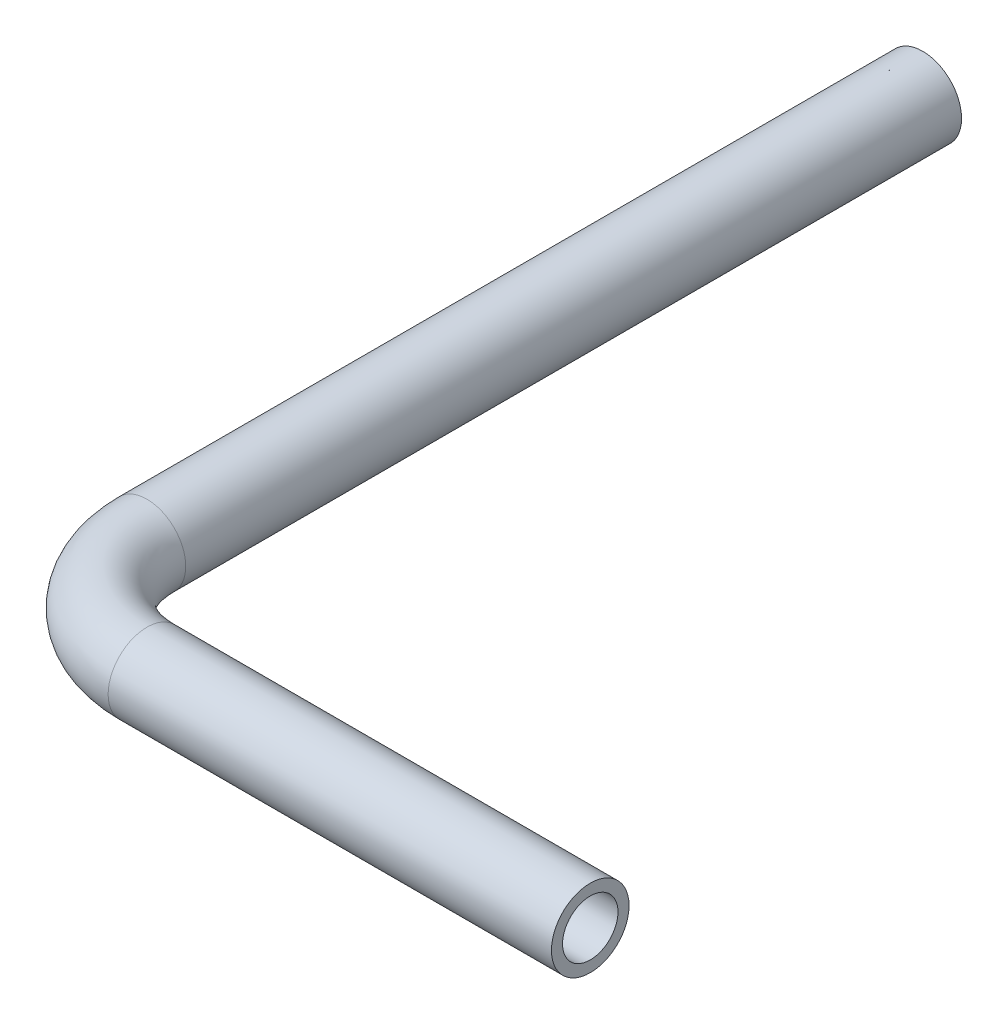
ISO-10303-21;
HEADER;
FILE_DESCRIPTION(('STEP AP214'),'2;1');
FILE_NAME('part.step','',(''),(''),'','','');
FILE_SCHEMA(('AUTOMOTIVE_DESIGN { 1 0 10303 214 1 1 1 1 }'));
ENDSEC;
DATA;
#1=APPLICATION_CONTEXT('core data for automotive mechanical design processes');
#2=APPLICATION_PROTOCOL_DEFINITION('international standard','automotive_design',2000,#1);
#3=PRODUCT_CONTEXT('',#1,'mechanical');
#4=PRODUCT('Part','Part','',(#3));
#5=PRODUCT_RELATED_PRODUCT_CATEGORY('part','',(#4));
#6=PRODUCT_DEFINITION_FORMATION('','',#4);
#7=PRODUCT_DEFINITION_CONTEXT('part definition',#1,'design');
#8=PRODUCT_DEFINITION('design','',#6,#7);
#9=PRODUCT_DEFINITION_SHAPE('','',#8);
#10=(LENGTH_UNIT() NAMED_UNIT(*) SI_UNIT(.MILLI.,.METRE.));
#11=(NAMED_UNIT(*) PLANE_ANGLE_UNIT() SI_UNIT($,.RADIAN.));
#12=(NAMED_UNIT(*) SI_UNIT($,.STERADIAN.) SOLID_ANGLE_UNIT());
#13=UNCERTAINTY_MEASURE_WITH_UNIT(LENGTH_MEASURE(1.E-05),#10,'distance_accuracy_value','');
#14=(GEOMETRIC_REPRESENTATION_CONTEXT(3) GLOBAL_UNCERTAINTY_ASSIGNED_CONTEXT((#13)) GLOBAL_UNIT_ASSIGNED_CONTEXT((#10,
#11,#12)) REPRESENTATION_CONTEXT('',''));
#15=CARTESIAN_POINT('',(0.,0.,0.));
#16=DIRECTION('',(0.,0.,1.));
#17=DIRECTION('',(1.,0.,0.));
#18=AXIS2_PLACEMENT_3D('',#15,#16,#17);
#19=CARTESIAN_POINT('',(0.,0.,0.));
#20=DIRECTION('',(-1.,0.,0.));
#21=DIRECTION('',(0.,0.,1.));
#22=AXIS2_PLACEMENT_3D('',#19,#20,#21);
#23=CYLINDRICAL_SURFACE('',#22,17.5);
#24=CARTESIAN_POINT('',(-450.,0.,0.));
#25=DIRECTION('',(1.,0.,0.));
#26=DIRECTION('',(0.,0.,-1.));
#27=AXIS2_PLACEMENT_3D('',#24,#25,#26);
#28=CIRCLE('',#27,17.5);
#29=CARTESIAN_POINT('',(-450.,0.,17.5000000000001));
#30=VERTEX_POINT('',#29);
#31=EDGE_CURVE('E54',#30,#30,#28,.T.);
#32=ORIENTED_EDGE('',*,*,#31,.T.);
#33=EDGE_LOOP('',(#32));
#34=FACE_BOUND('',#33,.T.);
#35=CARTESIAN_POINT('',(-250.,0.,0.));
#36=DIRECTION('',(1.,0.,0.));
#37=DIRECTION('',(0.,0.,-1.));
#38=AXIS2_PLACEMENT_3D('',#35,#36,#37);
#39=CIRCLE('',#38,17.5);
#40=CARTESIAN_POINT('',(-250.,0.,-17.5));
#41=VERTEX_POINT('',#40);
#42=EDGE_CURVE('E56',#41,#41,#39,.T.);
#43=ORIENTED_EDGE('',*,*,#42,.F.);
#44=EDGE_LOOP('',(#43));
#45=FACE_BOUND('',#44,.T.);
#46=ADVANCED_FACE('F35',(#34,#45),#23,.T.);
#47=CARTESIAN_POINT('',(0.,0.,0.));
#48=DIRECTION('',(-1.,0.,0.));
#49=DIRECTION('',(0.,0.,1.));
#50=AXIS2_PLACEMENT_3D('',#47,#48,#49);
#51=CYLINDRICAL_SURFACE('',#50,12.5);
#52=CARTESIAN_POINT('',(-450.,0.,0.));
#53=DIRECTION('',(1.,0.,0.));
#54=DIRECTION('',(0.,0.,-1.));
#55=AXIS2_PLACEMENT_3D('',#52,#53,#54);
#56=CIRCLE('',#55,12.5);
#57=CARTESIAN_POINT('',(-450.,0.,12.5000000000001));
#58=VERTEX_POINT('',#57);
#59=EDGE_CURVE('E48',#58,#58,#56,.F.);
#60=ORIENTED_EDGE('',*,*,#59,.T.);
#61=EDGE_LOOP('',(#60));
#62=FACE_BOUND('',#61,.T.);
#63=CARTESIAN_POINT('',(-250.,0.,0.));
#64=DIRECTION('',(1.,0.,0.));
#65=DIRECTION('',(0.,0.,-1.));
#66=AXIS2_PLACEMENT_3D('',#63,#64,#65);
#67=CIRCLE('',#66,12.5);
#68=CARTESIAN_POINT('',(-250.,0.,-12.5));
#69=VERTEX_POINT('',#68);
#70=EDGE_CURVE('E61',#69,#69,#67,.T.);
#71=ORIENTED_EDGE('',*,*,#70,.T.);
#72=EDGE_LOOP('',(#71));
#73=FACE_BOUND('',#72,.T.);
#74=ADVANCED_FACE('F70',(#62,#73),#51,.F.);
#75=CARTESIAN_POINT('',(-450.,0.,-50.));
#76=DIRECTION('',(0.,-1.,0.));
#77=DIRECTION('',(0.,0.,-1.));
#78=AXIS2_PLACEMENT_3D('',#75,#76,#77);
#79=TOROIDAL_SURFACE('',#78,50.,17.5);
#80=CARTESIAN_POINT('',(-500.,0.,-49.9999999999999));
#81=DIRECTION('',(0.,0.,1.));
#82=DIRECTION('',(1.,0.,0.));
#83=AXIS2_PLACEMENT_3D('',#80,#81,#82);
#84=CIRCLE('',#83,17.5);
#85=CARTESIAN_POINT('',(-517.5,0.,-49.9999999999999));
#86=VERTEX_POINT('',#85);
#87=EDGE_CURVE('E39',#86,#86,#84,.T.);
#88=CARTESIAN_POINT('',(-450.,0.,-50.));
#89=DIRECTION('',(0.,-1.,0.));
#90=DIRECTION('',(0.,0.,-1.));
#91=AXIS2_PLACEMENT_3D('',#88,#89,#90);
#92=CIRCLE('',#91,67.5);
#93=EDGE_CURVE('',#30,#86,#92,.T.);
#94=ORIENTED_EDGE('',*,*,#31,.F.);
#95=ORIENTED_EDGE('',*,*,#87,.T.);
#96=ORIENTED_EDGE('',*,*,#93,.T.);
#97=ORIENTED_EDGE('',*,*,#93,.F.);
#98=EDGE_LOOP('',(#94,#96,#95,#97));
#99=FACE_BOUND('',#98,.T.);
#100=ADVANCED_FACE('F93',(#99),#79,.T.);
#101=CARTESIAN_POINT('',(-500.,0.,-49.9999999999999));
#102=DIRECTION('',(0.,0.,-1.));
#103=DIRECTION('',(-1.,0.,0.));
#104=AXIS2_PLACEMENT_3D('',#101,#102,#103);
#105=CYLINDRICAL_SURFACE('',#104,17.5);
#106=CARTESIAN_POINT('',(-500.,0.,-400.));
#107=DIRECTION('',(0.,0.,1.));
#108=DIRECTION('',(1.,0.,0.));
#109=AXIS2_PLACEMENT_3D('',#106,#107,#108);
#110=CIRCLE('',#109,17.5);
#111=CARTESIAN_POINT('',(-482.5,0.,-400.));
#112=VERTEX_POINT('',#111);
#113=EDGE_CURVE('E52',#112,#112,#110,.T.);
#114=ORIENTED_EDGE('',*,*,#113,.T.);
#115=EDGE_LOOP('',(#114));
#116=FACE_BOUND('',#115,.T.);
#117=ORIENTED_EDGE('',*,*,#87,.F.);
#118=EDGE_LOOP('',(#117));
#119=FACE_BOUND('',#118,.T.);
#120=ADVANCED_FACE('F37',(#116,#119),#105,.T.);
#121=CARTESIAN_POINT('',(-500.,0.,-400.));
#122=DIRECTION('',(0.,0.,1.));
#123=DIRECTION('',(1.,0.,0.));
#124=AXIS2_PLACEMENT_3D('',#121,#122,#123);
#125=PLANE('',#124);
#126=CARTESIAN_POINT('',(-500.,0.,-400.));
#127=DIRECTION('',(0.,0.,1.));
#128=DIRECTION('',(1.,0.,0.));
#129=AXIS2_PLACEMENT_3D('',#126,#127,#128);
#130=CIRCLE('',#129,12.5);
#131=CARTESIAN_POINT('',(-487.5,0.,-400.));
#132=VERTEX_POINT('',#131);
#133=EDGE_CURVE('E10',#132,#132,#130,.F.);
#134=ORIENTED_EDGE('',*,*,#133,.F.);
#135=EDGE_LOOP('',(#134));
#136=FACE_BOUND('',#135,.T.);
#137=ORIENTED_EDGE('',*,*,#113,.F.);
#138=EDGE_LOOP('',(#137));
#139=FACE_BOUND('',#138,.T.);
#140=ADVANCED_FACE('F76',(#136,#139),#125,.F.);
#141=CARTESIAN_POINT('',(-450.,0.,-50.));
#142=DIRECTION('',(0.,-1.,0.));
#143=DIRECTION('',(0.,0.,-1.));
#144=AXIS2_PLACEMENT_3D('',#141,#142,#143);
#145=TOROIDAL_SURFACE('',#144,50.,12.5);
#146=CARTESIAN_POINT('',(-500.,0.,-49.9999999999999));
#147=DIRECTION('',(0.,0.,1.));
#148=DIRECTION('',(1.,0.,0.));
#149=AXIS2_PLACEMENT_3D('',#146,#147,#148);
#150=CIRCLE('',#149,12.5);
#151=CARTESIAN_POINT('',(-512.5,0.,-49.9999999999999));
#152=VERTEX_POINT('',#151);
#153=EDGE_CURVE('E43',#152,#152,#150,.F.);
#154=CARTESIAN_POINT('',(-450.,0.,-50.));
#155=DIRECTION('',(0.,-1.,0.));
#156=DIRECTION('',(0.,0.,-1.));
#157=AXIS2_PLACEMENT_3D('',#154,#155,#156);
#158=CIRCLE('',#157,62.5);
#159=EDGE_CURVE('',#58,#152,#158,.T.);
#160=ORIENTED_EDGE('',*,*,#59,.F.);
#161=ORIENTED_EDGE('',*,*,#153,.T.);
#162=ORIENTED_EDGE('',*,*,#159,.T.);
#163=ORIENTED_EDGE('',*,*,#159,.F.);
#164=EDGE_LOOP('',(#160,#162,#161,#163));
#165=FACE_BOUND('',#164,.T.);
#166=ADVANCED_FACE('F73',(#165),#145,.F.);
#167=CARTESIAN_POINT('',(-500.,0.,-49.9999999999999));
#168=DIRECTION('',(0.,0.,-1.));
#169=DIRECTION('',(-1.,0.,0.));
#170=AXIS2_PLACEMENT_3D('',#167,#168,#169);
#171=CYLINDRICAL_SURFACE('',#170,12.5);
#172=ORIENTED_EDGE('',*,*,#133,.T.);
#173=EDGE_LOOP('',(#172));
#174=FACE_BOUND('',#173,.T.);
#175=ORIENTED_EDGE('',*,*,#153,.F.);
#176=EDGE_LOOP('',(#175));
#177=FACE_BOUND('',#176,.T.);
#178=ADVANCED_FACE('F75',(#174,#177),#171,.F.);
#179=CARTESIAN_POINT('',(-250.,0.,0.));
#180=DIRECTION('',(1.,0.,0.));
#181=DIRECTION('',(0.,0.,-1.));
#182=AXIS2_PLACEMENT_3D('',#179,#180,#181);
#183=PLANE('',#182);
#184=ORIENTED_EDGE('',*,*,#42,.T.);
#185=EDGE_LOOP('',(#184));
#186=FACE_BOUND('',#185,.T.);
#187=ORIENTED_EDGE('',*,*,#70,.F.);
#188=EDGE_LOOP('',(#187));
#189=FACE_BOUND('',#188,.T.);
#190=ADVANCED_FACE('F83',(#186,#189),#183,.T.);
#191=CLOSED_SHELL('',(#46,#74,#100,#120,#140,#166,#178,#190));
#192=MANIFOLD_SOLID_BREP('B2',#191);
#193=ADVANCED_BREP_SHAPE_REPRESENTATION('',(#18,#192),#14);
#194=SHAPE_DEFINITION_REPRESENTATION(#9,#193);
ENDSEC;
END-ISO-10303-21;
